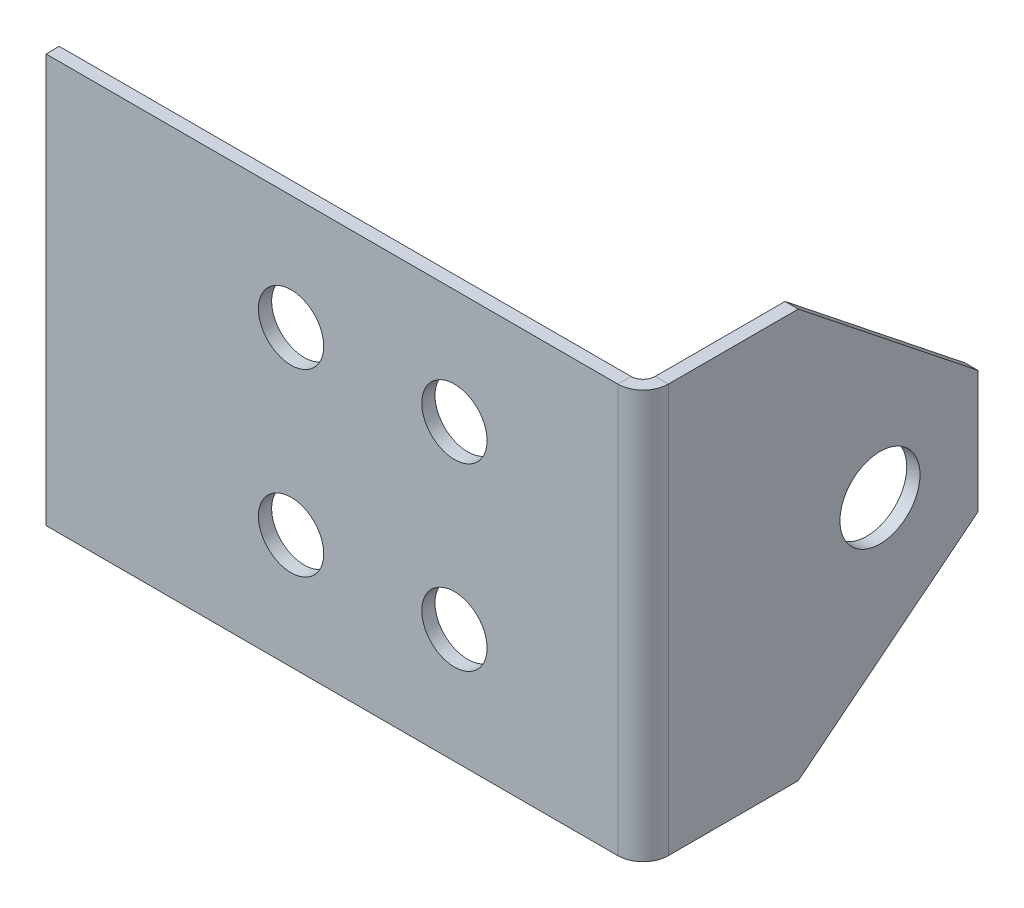
ISO-10303-21;
HEADER;
FILE_DESCRIPTION(('STEP AP214'),'2;1');
FILE_NAME('part.step','',(''),(''),'','','');
FILE_SCHEMA(('AUTOMOTIVE_DESIGN { 1 0 10303 214 1 1 1 1 }'));
ENDSEC;
DATA;
#1=APPLICATION_CONTEXT('core data for automotive mechanical design processes');
#2=APPLICATION_PROTOCOL_DEFINITION('international standard','automotive_design',2000,#1);
#3=PRODUCT_CONTEXT('',#1,'mechanical');
#4=PRODUCT('Part','Part','',(#3));
#5=PRODUCT_RELATED_PRODUCT_CATEGORY('part','',(#4));
#6=PRODUCT_DEFINITION_FORMATION('','',#4);
#7=PRODUCT_DEFINITION_CONTEXT('part definition',#1,'design');
#8=PRODUCT_DEFINITION('design','',#6,#7);
#9=PRODUCT_DEFINITION_SHAPE('','',#8);
#10=(LENGTH_UNIT() NAMED_UNIT(*) SI_UNIT(.MILLI.,.METRE.));
#11=(NAMED_UNIT(*) PLANE_ANGLE_UNIT() SI_UNIT($,.RADIAN.));
#12=(NAMED_UNIT(*) SI_UNIT($,.STERADIAN.) SOLID_ANGLE_UNIT());
#13=UNCERTAINTY_MEASURE_WITH_UNIT(LENGTH_MEASURE(1.E-05),#10,'distance_accuracy_value','');
#14=(GEOMETRIC_REPRESENTATION_CONTEXT(3) GLOBAL_UNCERTAINTY_ASSIGNED_CONTEXT((#13)) GLOBAL_UNIT_ASSIGNED_CONTEXT((#10,
#11,#12)) REPRESENTATION_CONTEXT('',''));
#15=CARTESIAN_POINT('',(0.,0.,0.));
#16=DIRECTION('',(0.,0.,1.));
#17=DIRECTION('',(1.,0.,0.));
#18=AXIS2_PLACEMENT_3D('',#15,#16,#17);
#19=CARTESIAN_POINT('',(36.5466,0.,1.23583931204287E-13));
#20=DIRECTION('',(1.,0.,0.));
#21=DIRECTION('',(0.,0.,-1.));
#22=AXIS2_PLACEMENT_3D('',#19,#20,#21);
#23=PLANE('',#22);
#24=CARTESIAN_POINT('',(36.5466,12.5,-14.5));
#25=DIRECTION('',(1.,0.,0.));
#26=DIRECTION('',(0.,0.,-1.));
#27=AXIS2_PLACEMENT_3D('',#24,#25,#26);
#28=CIRCLE('',#27,2.45);
#29=CARTESIAN_POINT('',(36.5466000000001,12.5,-16.95));
#30=VERTEX_POINT('',#29);
#31=EDGE_CURVE('E204',#30,#30,#28,.F.);
#32=ORIENTED_EDGE('',*,*,#31,.T.);
#33=EDGE_LOOP('',(#32));
#34=FACE_BOUND('',#33,.T.);
#35=DIRECTION('',(0.,0.,1.));
#36=VECTOR('',#35,1.);
#37=CARTESIAN_POINT('',(36.5466,0.,-0.809999999999997));
#38=LINE('',#37,#36);
#39=CARTESIAN_POINT('',(36.5466000000001,0.,-9.49999999999999));
#40=VERTEX_POINT('',#39);
#41=CARTESIAN_POINT('',(36.5466,0.,-1.54659999999999));
#42=VERTEX_POINT('',#41);
#43=EDGE_CURVE('E148',#40,#42,#38,.T.);
#44=ORIENTED_EDGE('',*,*,#43,.F.);
#45=DIRECTION('',(0.,0.622523565821539,-0.782601054175649));
#46=VECTOR('',#45,1.);
#47=CARTESIAN_POINT('',(36.5466000000001,8.75,-20.5));
#48=LINE('',#47,#46);
#49=CARTESIAN_POINT('',(36.5466000000001,8.75,-20.5));
#50=VERTEX_POINT('',#49);
#51=EDGE_CURVE('E220',#40,#50,#48,.T.);
#52=ORIENTED_EDGE('',*,*,#51,.T.);
#53=DIRECTION('',(0.,1.,0.));
#54=VECTOR('',#53,1.);
#55=CARTESIAN_POINT('',(36.5466000000001,16.25,-20.5));
#56=LINE('',#55,#54);
#57=CARTESIAN_POINT('',(36.5466000000001,16.25,-20.5));
#58=VERTEX_POINT('',#57);
#59=EDGE_CURVE('E223',#50,#58,#56,.T.);
#60=ORIENTED_EDGE('',*,*,#59,.T.);
#61=DIRECTION('',(0.,0.622523565821539,0.782601054175649));
#62=VECTOR('',#61,1.);
#63=CARTESIAN_POINT('',(36.5466,25.,-9.49999999999999));
#64=LINE('',#63,#62);
#65=CARTESIAN_POINT('',(36.5466000000001,25.,-9.49999999999999));
#66=VERTEX_POINT('',#65);
#67=EDGE_CURVE('E226',#58,#66,#64,.T.);
#68=ORIENTED_EDGE('',*,*,#67,.T.);
#69=DIRECTION('',(0.,0.,-1.));
#70=VECTOR('',#69,1.);
#71=CARTESIAN_POINT('',(36.5466000000001,25.,-35.));
#72=LINE('',#71,#70);
#73=CARTESIAN_POINT('',(36.5466,25.,-1.54659999999999));
#74=VERTEX_POINT('',#73);
#75=EDGE_CURVE('E175',#74,#66,#72,.T.);
#76=ORIENTED_EDGE('',*,*,#75,.F.);
#77=DIRECTION('',(0.,-1.,0.));
#78=VECTOR('',#77,1.);
#79=CARTESIAN_POINT('',(36.5466,0.,-1.54659999999999));
#80=LINE('',#79,#78);
#81=EDGE_CURVE('E166',#74,#42,#80,.T.);
#82=ORIENTED_EDGE('',*,*,#81,.T.);
#83=EDGE_LOOP('',(#44,#52,#60,#68,#76,#82));
#84=FACE_BOUND('',#83,.T.);
#85=ADVANCED_FACE('F59',(#34,#84),#23,.T.);
#86=CARTESIAN_POINT('',(35.7366,0.,1.20755831319825E-13));
#87=DIRECTION('',(1.,0.,0.));
#88=DIRECTION('',(0.,0.,-1.));
#89=AXIS2_PLACEMENT_3D('',#86,#87,#88);
#90=PLANE('',#89);
#91=CARTESIAN_POINT('',(35.7366,12.5,-14.5));
#92=DIRECTION('',(1.,0.,0.));
#93=DIRECTION('',(0.,0.,-1.));
#94=AXIS2_PLACEMENT_3D('',#91,#92,#93);
#95=CIRCLE('',#94,2.45);
#96=CARTESIAN_POINT('',(35.7366000000001,12.5,-16.95));
#97=VERTEX_POINT('',#96);
#98=EDGE_CURVE('E203',#97,#97,#95,.F.);
#99=ORIENTED_EDGE('',*,*,#98,.F.);
#100=EDGE_LOOP('',(#99));
#101=FACE_BOUND('',#100,.T.);
#102=DIRECTION('',(0.,0.622523565821539,-0.782601054175649));
#103=VECTOR('',#102,1.);
#104=CARTESIAN_POINT('',(35.7366000000001,8.75,-20.5));
#105=LINE('',#104,#103);
#106=CARTESIAN_POINT('',(35.7366,0.,-9.49999999999999));
#107=VERTEX_POINT('',#106);
#108=CARTESIAN_POINT('',(35.7366000000001,8.75,-20.5));
#109=VERTEX_POINT('',#108);
#110=EDGE_CURVE('E213',#107,#109,#105,.T.);
#111=ORIENTED_EDGE('',*,*,#110,.F.);
#112=DIRECTION('',(0.,0.,-1.));
#113=VECTOR('',#112,1.);
#114=CARTESIAN_POINT('',(35.7366,0.,1.20755831319825E-13));
#115=LINE('',#114,#113);
#116=CARTESIAN_POINT('',(35.7366,0.,-1.5466));
#117=VERTEX_POINT('',#116);
#118=EDGE_CURVE('E172',#107,#117,#115,.F.);
#119=ORIENTED_EDGE('',*,*,#118,.T.);
#120=DIRECTION('',(0.,1.,0.));
#121=VECTOR('',#120,1.);
#122=CARTESIAN_POINT('',(35.7366,25.,-1.5466));
#123=LINE('',#122,#121);
#124=CARTESIAN_POINT('',(35.7366,25.,-1.5466));
#125=VERTEX_POINT('',#124);
#126=EDGE_CURVE('E159',#125,#117,#123,.F.);
#127=ORIENTED_EDGE('',*,*,#126,.F.);
#128=DIRECTION('',(0.,0.,1.));
#129=VECTOR('',#128,1.);
#130=CARTESIAN_POINT('',(35.7366,25.,1.20755831319825E-13));
#131=LINE('',#130,#129);
#132=CARTESIAN_POINT('',(35.7366,25.,-9.49999999999999));
#133=VERTEX_POINT('',#132);
#134=EDGE_CURVE('E169',#125,#133,#131,.F.);
#135=ORIENTED_EDGE('',*,*,#134,.T.);
#136=DIRECTION('',(0.,0.622523565821539,0.782601054175649));
#137=VECTOR('',#136,1.);
#138=CARTESIAN_POINT('',(35.7366,25.,-9.49999999999999));
#139=LINE('',#138,#137);
#140=CARTESIAN_POINT('',(35.7366000000001,16.25,-20.5));
#141=VERTEX_POINT('',#140);
#142=EDGE_CURVE('E76',#141,#133,#139,.T.);
#143=ORIENTED_EDGE('',*,*,#142,.F.);
#144=DIRECTION('',(0.,1.,0.));
#145=VECTOR('',#144,1.);
#146=CARTESIAN_POINT('',(35.7366000000001,0.,-20.5));
#147=LINE('',#146,#145);
#148=EDGE_CURVE('E230',#109,#141,#147,.T.);
#149=ORIENTED_EDGE('',*,*,#148,.F.);
#150=EDGE_LOOP('',(#111,#119,#127,#135,#143,#149));
#151=FACE_BOUND('',#150,.T.);
#152=ADVANCED_FACE('F252',(#101,#151),#90,.F.);
#153=CARTESIAN_POINT('',(36.5466,0.,-0.809999999999997));
#154=DIRECTION('',(0.,-1.,0.));
#155=DIRECTION('',(0.,0.,-1.));
#156=AXIS2_PLACEMENT_3D('',#153,#154,#155);
#157=PLANE('',#156);
#158=ORIENTED_EDGE('',*,*,#118,.F.);
#159=DIRECTION('',(1.,0.,0.));
#160=VECTOR('',#159,1.);
#161=CARTESIAN_POINT('',(36.5466000000001,0.,-9.49999999999999));
#162=LINE('',#161,#160);
#163=EDGE_CURVE('E212',#40,#107,#162,.F.);
#164=ORIENTED_EDGE('',*,*,#163,.F.);
#165=ORIENTED_EDGE('',*,*,#43,.T.);
#166=DIRECTION('',(1.,0.,0.));
#167=VECTOR('',#166,1.);
#168=CARTESIAN_POINT('',(35.7366,0.,-1.5466));
#169=LINE('',#168,#167);
#170=EDGE_CURVE('E163',#117,#42,#169,.T.);
#171=ORIENTED_EDGE('',*,*,#170,.F.);
#172=EDGE_LOOP('',(#158,#164,#165,#171));
#173=FACE_BOUND('',#172,.T.);
#174=ADVANCED_FACE('F284',(#173),#157,.T.);
#175=CARTESIAN_POINT('',(36.5466000000001,25.,-35.));
#176=DIRECTION('',(0.,1.,0.));
#177=DIRECTION('',(0.,0.,1.));
#178=AXIS2_PLACEMENT_3D('',#175,#176,#177);
#179=PLANE('',#178);
#180=ORIENTED_EDGE('',*,*,#75,.T.);
#181=DIRECTION('',(1.,0.,0.));
#182=VECTOR('',#181,1.);
#183=CARTESIAN_POINT('',(36.5466000000001,25.,-9.49999999999999));
#184=LINE('',#183,#182);
#185=EDGE_CURVE('E210',#66,#133,#184,.F.);
#186=ORIENTED_EDGE('',*,*,#185,.T.);
#187=ORIENTED_EDGE('',*,*,#134,.F.);
#188=DIRECTION('',(1.,0.,0.));
#189=VECTOR('',#188,1.);
#190=CARTESIAN_POINT('',(36.5466,25.,-1.5466));
#191=LINE('',#190,#189);
#192=EDGE_CURVE('E156',#125,#74,#191,.T.);
#193=ORIENTED_EDGE('',*,*,#192,.T.);
#194=EDGE_LOOP('',(#180,#186,#187,#193));
#195=FACE_BOUND('',#194,.T.);
#196=ADVANCED_FACE('F294',(#195),#179,.T.);
#197=CARTESIAN_POINT('',(0.,0.,-0.81));
#198=DIRECTION('',(-1.,0.,0.));
#199=DIRECTION('',(0.,0.,1.));
#200=AXIS2_PLACEMENT_3D('',#197,#198,#199);
#201=PLANE('',#200);
#202=DIRECTION('',(0.,-1.,0.));
#203=VECTOR('',#202,1.);
#204=CARTESIAN_POINT('',(0.,0.,0.));
#205=LINE('',#204,#203);
#206=CARTESIAN_POINT('',(0.,25.,0.));
#207=VERTEX_POINT('',#206);
#208=CARTESIAN_POINT('',(0.,0.,0.));
#209=VERTEX_POINT('',#208);
#210=EDGE_CURVE('E106',#207,#209,#205,.T.);
#211=ORIENTED_EDGE('',*,*,#210,.F.);
#212=DIRECTION('',(0.,0.,1.));
#213=VECTOR('',#212,1.);
#214=CARTESIAN_POINT('',(0.,25.,-0.81));
#215=LINE('',#214,#213);
#216=CARTESIAN_POINT('',(0.,25.,-0.81));
#217=VERTEX_POINT('',#216);
#218=EDGE_CURVE('E13',#217,#207,#215,.T.);
#219=ORIENTED_EDGE('',*,*,#218,.F.);
#220=DIRECTION('',(0.,-1.,0.));
#221=VECTOR('',#220,1.);
#222=CARTESIAN_POINT('',(0.,0.,-0.81));
#223=LINE('',#222,#221);
#224=CARTESIAN_POINT('',(0.,0.,-0.81));
#225=VERTEX_POINT('',#224);
#226=EDGE_CURVE('E117',#217,#225,#223,.T.);
#227=ORIENTED_EDGE('',*,*,#226,.T.);
#228=DIRECTION('',(0.,0.,1.));
#229=VECTOR('',#228,1.);
#230=CARTESIAN_POINT('',(0.,0.,-0.81));
#231=LINE('',#230,#229);
#232=EDGE_CURVE('E63',#225,#209,#231,.T.);
#233=ORIENTED_EDGE('',*,*,#232,.T.);
#234=EDGE_LOOP('',(#211,#219,#227,#233));
#235=FACE_BOUND('',#234,.T.);
#236=ADVANCED_FACE('F61',(#235),#201,.T.);
#237=CARTESIAN_POINT('',(0.,25.,-0.81));
#238=DIRECTION('',(0.,1.,0.));
#239=DIRECTION('',(-1.,0.,0.));
#240=AXIS2_PLACEMENT_3D('',#237,#238,#239);
#241=PLANE('',#240);
#242=DIRECTION('',(-1.,0.,0.));
#243=VECTOR('',#242,1.);
#244=CARTESIAN_POINT('',(0.,25.,0.));
#245=LINE('',#244,#243);
#246=CARTESIAN_POINT('',(35.,25.,0.));
#247=VERTEX_POINT('',#246);
#248=EDGE_CURVE('E102',#247,#207,#245,.T.);
#249=ORIENTED_EDGE('',*,*,#248,.F.);
#250=DIRECTION('',(0.,0.,1.));
#251=VECTOR('',#250,1.);
#252=CARTESIAN_POINT('',(35.,25.,-0.81));
#253=LINE('',#252,#251);
#254=CARTESIAN_POINT('',(35.,25.,-0.809999999999994));
#255=VERTEX_POINT('',#254);
#256=EDGE_CURVE('E68',#255,#247,#253,.T.);
#257=ORIENTED_EDGE('',*,*,#256,.F.);
#258=DIRECTION('',(-1.,0.,0.));
#259=VECTOR('',#258,1.);
#260=CARTESIAN_POINT('',(0.,25.,-0.81));
#261=LINE('',#260,#259);
#262=EDGE_CURVE('E104',#255,#217,#261,.T.);
#263=ORIENTED_EDGE('',*,*,#262,.T.);
#264=ORIENTED_EDGE('',*,*,#218,.T.);
#265=EDGE_LOOP('',(#249,#257,#263,#264));
#266=FACE_BOUND('',#265,.T.);
#267=ADVANCED_FACE('F99',(#266),#241,.T.);
#268=CARTESIAN_POINT('',(0.,0.,-0.81));
#269=DIRECTION('',(0.,-1.,0.));
#270=DIRECTION('',(0.,0.,-1.));
#271=AXIS2_PLACEMENT_3D('',#268,#269,#270);
#272=PLANE('',#271);
#273=DIRECTION('',(1.,0.,0.));
#274=VECTOR('',#273,1.);
#275=CARTESIAN_POINT('',(0.,0.,0.));
#276=LINE('',#275,#274);
#277=CARTESIAN_POINT('',(35.,0.,0.));
#278=VERTEX_POINT('',#277);
#279=EDGE_CURVE('E110',#209,#278,#276,.T.);
#280=ORIENTED_EDGE('',*,*,#279,.F.);
#281=ORIENTED_EDGE('',*,*,#232,.F.);
#282=DIRECTION('',(1.,0.,0.));
#283=VECTOR('',#282,1.);
#284=CARTESIAN_POINT('',(0.,0.,-0.81));
#285=LINE('',#284,#283);
#286=CARTESIAN_POINT('',(35.,0.,-0.809999999999994));
#287=VERTEX_POINT('',#286);
#288=EDGE_CURVE('E119',#225,#287,#285,.T.);
#289=ORIENTED_EDGE('',*,*,#288,.T.);
#290=DIRECTION('',(0.,0.,1.));
#291=VECTOR('',#290,1.);
#292=CARTESIAN_POINT('',(35.,0.,-0.81));
#293=LINE('',#292,#291);
#294=EDGE_CURVE('E125',#287,#278,#293,.T.);
#295=ORIENTED_EDGE('',*,*,#294,.T.);
#296=EDGE_LOOP('',(#280,#281,#289,#295));
#297=FACE_BOUND('',#296,.T.);
#298=ADVANCED_FACE('F137',(#297),#272,.T.);
#299=CARTESIAN_POINT('',(0.,0.,-0.81));
#300=DIRECTION('',(0.,0.,-1.));
#301=DIRECTION('',(-1.,0.,0.));
#302=AXIS2_PLACEMENT_3D('',#299,#300,#301);
#303=PLANE('',#302);
#304=CARTESIAN_POINT('',(15.,7.00000000000002,-0.81));
#305=DIRECTION('',(0.,0.,-1.));
#306=DIRECTION('',(-1.,0.,0.));
#307=AXIS2_PLACEMENT_3D('',#304,#305,#306);
#308=CIRCLE('',#307,2.);
#309=CARTESIAN_POINT('',(13.,7.00000000000002,-0.81));
#310=VERTEX_POINT('',#309);
#311=EDGE_CURVE('E200',#310,#310,#308,.T.);
#312=ORIENTED_EDGE('',*,*,#311,.F.);
#313=EDGE_LOOP('',(#312));
#314=FACE_BOUND('',#313,.T.);
#315=CARTESIAN_POINT('',(15.,18.,-0.81));
#316=DIRECTION('',(0.,0.,-1.));
#317=DIRECTION('',(-1.,0.,0.));
#318=AXIS2_PLACEMENT_3D('',#315,#316,#317);
#319=CIRCLE('',#318,2.);
#320=CARTESIAN_POINT('',(13.,18.,-0.81));
#321=VERTEX_POINT('',#320);
#322=EDGE_CURVE('E194',#321,#321,#319,.T.);
#323=ORIENTED_EDGE('',*,*,#322,.F.);
#324=EDGE_LOOP('',(#323));
#325=FACE_BOUND('',#324,.T.);
#326=CARTESIAN_POINT('',(25.,7.00000000000002,-0.81));
#327=DIRECTION('',(0.,0.,-1.));
#328=DIRECTION('',(-1.,0.,0.));
#329=AXIS2_PLACEMENT_3D('',#326,#327,#328);
#330=CIRCLE('',#329,2.);
#331=CARTESIAN_POINT('',(23.,7.00000000000002,-0.81));
#332=VERTEX_POINT('',#331);
#333=EDGE_CURVE('E188',#332,#332,#330,.T.);
#334=ORIENTED_EDGE('',*,*,#333,.F.);
#335=EDGE_LOOP('',(#334));
#336=FACE_BOUND('',#335,.T.);
#337=CARTESIAN_POINT('',(25.,18.,-0.81));
#338=DIRECTION('',(0.,0.,-1.));
#339=DIRECTION('',(-1.,0.,0.));
#340=AXIS2_PLACEMENT_3D('',#337,#338,#339);
#341=CIRCLE('',#340,2.00000000000001);
#342=CARTESIAN_POINT('',(23.,18.,-0.81));
#343=VERTEX_POINT('',#342);
#344=EDGE_CURVE('E182',#343,#343,#341,.T.);
#345=ORIENTED_EDGE('',*,*,#344,.F.);
#346=EDGE_LOOP('',(#345));
#347=FACE_BOUND('',#346,.T.);
#348=ORIENTED_EDGE('',*,*,#226,.F.);
#349=ORIENTED_EDGE('',*,*,#262,.F.);
#350=DIRECTION('',(0.,1.,0.));
#351=VECTOR('',#350,1.);
#352=CARTESIAN_POINT('',(35.,0.,-0.81));
#353=LINE('',#352,#351);
#354=EDGE_CURVE('E130',#287,#255,#353,.T.);
#355=ORIENTED_EDGE('',*,*,#354,.F.);
#356=ORIENTED_EDGE('',*,*,#288,.F.);
#357=EDGE_LOOP('',(#348,#349,#355,#356));
#358=FACE_BOUND('',#357,.T.);
#359=ADVANCED_FACE('F142',(#314,#325,#336,#347,#358),#303,.T.);
#360=CARTESIAN_POINT('',(0.,0.,0.));
#361=DIRECTION('',(0.,0.,-1.));
#362=DIRECTION('',(-1.,0.,0.));
#363=AXIS2_PLACEMENT_3D('',#360,#361,#362);
#364=PLANE('',#363);
#365=CARTESIAN_POINT('',(15.,7.00000000000002,0.));
#366=DIRECTION('',(0.,0.,-1.));
#367=DIRECTION('',(-1.,0.,0.));
#368=AXIS2_PLACEMENT_3D('',#365,#366,#367);
#369=CIRCLE('',#368,2.);
#370=CARTESIAN_POINT('',(13.,7.00000000000002,0.));
#371=VERTEX_POINT('',#370);
#372=EDGE_CURVE('E197',#371,#371,#369,.F.);
#373=ORIENTED_EDGE('',*,*,#372,.F.);
#374=EDGE_LOOP('',(#373));
#375=FACE_BOUND('',#374,.T.);
#376=CARTESIAN_POINT('',(15.,18.,0.));
#377=DIRECTION('',(0.,0.,-1.));
#378=DIRECTION('',(-1.,0.,0.));
#379=AXIS2_PLACEMENT_3D('',#376,#377,#378);
#380=CIRCLE('',#379,2.);
#381=CARTESIAN_POINT('',(13.,18.,0.));
#382=VERTEX_POINT('',#381);
#383=EDGE_CURVE('E191',#382,#382,#380,.F.);
#384=ORIENTED_EDGE('',*,*,#383,.F.);
#385=EDGE_LOOP('',(#384));
#386=FACE_BOUND('',#385,.T.);
#387=CARTESIAN_POINT('',(25.,7.00000000000002,0.));
#388=DIRECTION('',(0.,0.,-1.));
#389=DIRECTION('',(-1.,0.,0.));
#390=AXIS2_PLACEMENT_3D('',#387,#388,#389);
#391=CIRCLE('',#390,2.);
#392=CARTESIAN_POINT('',(23.,7.00000000000002,0.));
#393=VERTEX_POINT('',#392);
#394=EDGE_CURVE('E185',#393,#393,#391,.F.);
#395=ORIENTED_EDGE('',*,*,#394,.F.);
#396=EDGE_LOOP('',(#395));
#397=FACE_BOUND('',#396,.T.);
#398=CARTESIAN_POINT('',(25.,18.,0.));
#399=DIRECTION('',(0.,0.,-1.));
#400=DIRECTION('',(-1.,0.,0.));
#401=AXIS2_PLACEMENT_3D('',#398,#399,#400);
#402=CIRCLE('',#401,2.00000000000001);
#403=CARTESIAN_POINT('',(23.,18.,0.));
#404=VERTEX_POINT('',#403);
#405=EDGE_CURVE('E160',#404,#404,#402,.F.);
#406=ORIENTED_EDGE('',*,*,#405,.F.);
#407=EDGE_LOOP('',(#406));
#408=FACE_BOUND('',#407,.T.);
#409=ORIENTED_EDGE('',*,*,#210,.T.);
#410=ORIENTED_EDGE('',*,*,#279,.T.);
#411=DIRECTION('',(0.,1.,0.));
#412=VECTOR('',#411,1.);
#413=CARTESIAN_POINT('',(35.,0.,0.));
#414=LINE('',#413,#412);
#415=EDGE_CURVE('E116',#278,#247,#414,.T.);
#416=ORIENTED_EDGE('',*,*,#415,.T.);
#417=ORIENTED_EDGE('',*,*,#248,.T.);
#418=EDGE_LOOP('',(#409,#410,#416,#417));
#419=FACE_BOUND('',#418,.T.);
#420=ADVANCED_FACE('F114',(#375,#386,#397,#408,#419),#364,.F.);
#421=CARTESIAN_POINT('',(35.,25.,-1.5466));
#422=DIRECTION('',(0.,1.,0.));
#423=DIRECTION('',(0.,0.,1.));
#424=AXIS2_PLACEMENT_3D('',#421,#422,#423);
#425=PLANE('',#424);
#426=ORIENTED_EDGE('',*,*,#192,.F.);
#427=CARTESIAN_POINT('',(35.,25.,-1.5466));
#428=DIRECTION('',(0.,-1.,0.));
#429=DIRECTION('',(0.,0.,-1.));
#430=AXIS2_PLACEMENT_3D('',#427,#428,#429);
#431=CIRCLE('',#430,0.736600000000004);
#432=EDGE_CURVE('E147',#255,#125,#431,.F.);
#433=ORIENTED_EDGE('',*,*,#432,.F.);
#434=ORIENTED_EDGE('',*,*,#256,.T.);
#435=CARTESIAN_POINT('',(35.,25.,-1.5466));
#436=DIRECTION('',(0.,-1.,0.));
#437=DIRECTION('',(0.,0.,-1.));
#438=AXIS2_PLACEMENT_3D('',#435,#436,#437);
#439=CIRCLE('',#438,1.5466);
#440=EDGE_CURVE('E111',#247,#74,#439,.F.);
#441=ORIENTED_EDGE('',*,*,#440,.T.);
#442=EDGE_LOOP('',(#426,#433,#434,#441));
#443=FACE_BOUND('',#442,.T.);
#444=ADVANCED_FACE('F291',(#443),#425,.T.);
#445=CARTESIAN_POINT('',(35.,0.,-1.5466));
#446=DIRECTION('',(0.,1.,0.));
#447=DIRECTION('',(0.,0.,1.));
#448=AXIS2_PLACEMENT_3D('',#445,#446,#447);
#449=PLANE('',#448);
#450=CARTESIAN_POINT('',(35.,0.,-1.5466));
#451=DIRECTION('',(0.,-1.,0.));
#452=DIRECTION('',(0.,0.,-1.));
#453=AXIS2_PLACEMENT_3D('',#450,#451,#452);
#454=CIRCLE('',#453,0.736600000000004);
#455=EDGE_CURVE('E144',#117,#287,#454,.T.);
#456=ORIENTED_EDGE('',*,*,#455,.F.);
#457=ORIENTED_EDGE('',*,*,#170,.T.);
#458=CARTESIAN_POINT('',(35.,0.,-1.5466));
#459=DIRECTION('',(0.,-1.,0.));
#460=DIRECTION('',(0.,0.,-1.));
#461=AXIS2_PLACEMENT_3D('',#458,#459,#460);
#462=CIRCLE('',#461,1.5466);
#463=EDGE_CURVE('E151',#42,#278,#462,.T.);
#464=ORIENTED_EDGE('',*,*,#463,.T.);
#465=ORIENTED_EDGE('',*,*,#294,.F.);
#466=EDGE_LOOP('',(#456,#457,#464,#465));
#467=FACE_BOUND('',#466,.T.);
#468=ADVANCED_FACE('F283',(#467),#449,.F.);
#469=CARTESIAN_POINT('',(35.,0.,-1.5466));
#470=DIRECTION('',(0.,-1.,0.));
#471=DIRECTION('',(1.,0.,0.));
#472=AXIS2_PLACEMENT_3D('',#469,#470,#471);
#473=CYLINDRICAL_SURFACE('',#472,1.5466);
#474=ORIENTED_EDGE('',*,*,#415,.F.);
#475=ORIENTED_EDGE('',*,*,#463,.F.);
#476=ORIENTED_EDGE('',*,*,#81,.F.);
#477=ORIENTED_EDGE('',*,*,#440,.F.);
#478=EDGE_LOOP('',(#474,#475,#476,#477));
#479=FACE_BOUND('',#478,.T.);
#480=ADVANCED_FACE('F289',(#479),#473,.T.);
#481=CARTESIAN_POINT('',(35.,0.,-1.5466));
#482=DIRECTION('',(0.,-1.,0.));
#483=DIRECTION('',(1.,0.,0.));
#484=AXIS2_PLACEMENT_3D('',#481,#482,#483);
#485=CYLINDRICAL_SURFACE('',#484,0.736600000000004);
#486=ORIENTED_EDGE('',*,*,#354,.T.);
#487=ORIENTED_EDGE('',*,*,#432,.T.);
#488=ORIENTED_EDGE('',*,*,#126,.T.);
#489=ORIENTED_EDGE('',*,*,#455,.T.);
#490=EDGE_LOOP('',(#486,#487,#488,#489));
#491=FACE_BOUND('',#490,.T.);
#492=ADVANCED_FACE('F280',(#491),#485,.F.);
#493=CARTESIAN_POINT('',(25.,18.,0.0010000000000061));
#494=DIRECTION('',(0.,0.,-1.));
#495=DIRECTION('',(-1.,0.,0.));
#496=AXIS2_PLACEMENT_3D('',#493,#494,#495);
#497=CYLINDRICAL_SURFACE('',#496,2.00000000000001);
#498=ORIENTED_EDGE('',*,*,#344,.T.);
#499=EDGE_LOOP('',(#498));
#500=FACE_BOUND('',#499,.T.);
#501=ORIENTED_EDGE('',*,*,#405,.T.);
#502=EDGE_LOOP('',(#501));
#503=FACE_BOUND('',#502,.T.);
#504=ADVANCED_FACE('F313',(#500,#503),#497,.F.);
#505=CARTESIAN_POINT('',(25.,7.00000000000002,0.0010000000000061));
#506=DIRECTION('',(0.,0.,-1.));
#507=DIRECTION('',(-1.,0.,0.));
#508=AXIS2_PLACEMENT_3D('',#505,#506,#507);
#509=CYLINDRICAL_SURFACE('',#508,2.);
#510=ORIENTED_EDGE('',*,*,#333,.T.);
#511=EDGE_LOOP('',(#510));
#512=FACE_BOUND('',#511,.T.);
#513=ORIENTED_EDGE('',*,*,#394,.T.);
#514=EDGE_LOOP('',(#513));
#515=FACE_BOUND('',#514,.T.);
#516=ADVANCED_FACE('F371',(#512,#515),#509,.F.);
#517=CARTESIAN_POINT('',(15.,18.,0.0010000000000061));
#518=DIRECTION('',(0.,0.,-1.));
#519=DIRECTION('',(-1.,0.,0.));
#520=AXIS2_PLACEMENT_3D('',#517,#518,#519);
#521=CYLINDRICAL_SURFACE('',#520,2.);
#522=ORIENTED_EDGE('',*,*,#322,.T.);
#523=EDGE_LOOP('',(#522));
#524=FACE_BOUND('',#523,.T.);
#525=ORIENTED_EDGE('',*,*,#383,.T.);
#526=EDGE_LOOP('',(#525));
#527=FACE_BOUND('',#526,.T.);
#528=ADVANCED_FACE('F378',(#524,#527),#521,.F.);
#529=CARTESIAN_POINT('',(15.,7.00000000000002,0.0010000000000061));
#530=DIRECTION('',(0.,0.,-1.));
#531=DIRECTION('',(-1.,0.,0.));
#532=AXIS2_PLACEMENT_3D('',#529,#530,#531);
#533=CYLINDRICAL_SURFACE('',#532,2.);
#534=ORIENTED_EDGE('',*,*,#311,.T.);
#535=EDGE_LOOP('',(#534));
#536=FACE_BOUND('',#535,.T.);
#537=ORIENTED_EDGE('',*,*,#372,.T.);
#538=EDGE_LOOP('',(#537));
#539=FACE_BOUND('',#538,.T.);
#540=ADVANCED_FACE('F385',(#536,#539),#533,.F.);
#541=CARTESIAN_POINT('',(36.5466,12.5,-14.5));
#542=DIRECTION('',(1.,0.,0.));
#543=DIRECTION('',(0.,0.,-1.));
#544=AXIS2_PLACEMENT_3D('',#541,#542,#543);
#545=CYLINDRICAL_SURFACE('',#544,2.45);
#546=ORIENTED_EDGE('',*,*,#98,.T.);
#547=EDGE_LOOP('',(#546));
#548=FACE_BOUND('',#547,.T.);
#549=ORIENTED_EDGE('',*,*,#31,.F.);
#550=EDGE_LOOP('',(#549));
#551=FACE_BOUND('',#550,.T.);
#552=ADVANCED_FACE('F393',(#548,#551),#545,.F.);
#553=CARTESIAN_POINT('',(36.5466000000001,16.25,-20.5));
#554=DIRECTION('',(0.,0.,-1.));
#555=DIRECTION('',(0.,1.,0.));
#556=AXIS2_PLACEMENT_3D('',#553,#554,#555);
#557=PLANE('',#556);
#558=DIRECTION('',(1.,0.,0.));
#559=VECTOR('',#558,1.);
#560=CARTESIAN_POINT('',(36.5466000000001,16.25,-20.5));
#561=LINE('',#560,#559);
#562=EDGE_CURVE('E207',#58,#141,#561,.F.);
#563=ORIENTED_EDGE('',*,*,#562,.F.);
#564=ORIENTED_EDGE('',*,*,#59,.F.);
#565=DIRECTION('',(1.,0.,0.));
#566=VECTOR('',#565,1.);
#567=CARTESIAN_POINT('',(36.5466000000001,8.75,-20.5));
#568=LINE('',#567,#566);
#569=EDGE_CURVE('E215',#50,#109,#568,.F.);
#570=ORIENTED_EDGE('',*,*,#569,.T.);
#571=ORIENTED_EDGE('',*,*,#148,.T.);
#572=EDGE_LOOP('',(#563,#564,#570,#571));
#573=FACE_BOUND('',#572,.T.);
#574=ADVANCED_FACE('F251',(#573),#557,.T.);
#575=CARTESIAN_POINT('',(36.5466000000001,8.75,-20.5));
#576=DIRECTION('',(0.,-0.782601054175649,-0.622523565821539));
#577=DIRECTION('',(0.,0.622523565821539,-0.782601054175649));
#578=AXIS2_PLACEMENT_3D('',#575,#576,#577);
#579=PLANE('',#578);
#580=ORIENTED_EDGE('',*,*,#569,.F.);
#581=ORIENTED_EDGE('',*,*,#51,.F.);
#582=ORIENTED_EDGE('',*,*,#163,.T.);
#583=ORIENTED_EDGE('',*,*,#110,.T.);
#584=EDGE_LOOP('',(#580,#581,#582,#583));
#585=FACE_BOUND('',#584,.T.);
#586=ADVANCED_FACE('F238',(#585),#579,.T.);
#587=CARTESIAN_POINT('',(36.5466,25.,-9.49999999999999));
#588=DIRECTION('',(0.,0.782601054175649,-0.622523565821539));
#589=DIRECTION('',(0.,0.622523565821539,0.782601054175649));
#590=AXIS2_PLACEMENT_3D('',#587,#588,#589);
#591=PLANE('',#590);
#592=ORIENTED_EDGE('',*,*,#67,.F.);
#593=ORIENTED_EDGE('',*,*,#562,.T.);
#594=ORIENTED_EDGE('',*,*,#142,.T.);
#595=ORIENTED_EDGE('',*,*,#185,.F.);
#596=EDGE_LOOP('',(#592,#593,#594,#595));
#597=FACE_BOUND('',#596,.T.);
#598=ADVANCED_FACE('F295',(#597),#591,.T.);
#599=CLOSED_SHELL('',(#85,#152,#174,#196,#236,#267,#298,#359,#420,#444,#468,#480,#492,#504,#516,
#528,#540,#552,#574,#586,#598));
#600=MANIFOLD_SOLID_BREP('B2',#599);
#601=ADVANCED_BREP_SHAPE_REPRESENTATION('',(#18,#600),#14);
#602=SHAPE_DEFINITION_REPRESENTATION(#9,#601);
ENDSEC;
END-ISO-10303-21;
